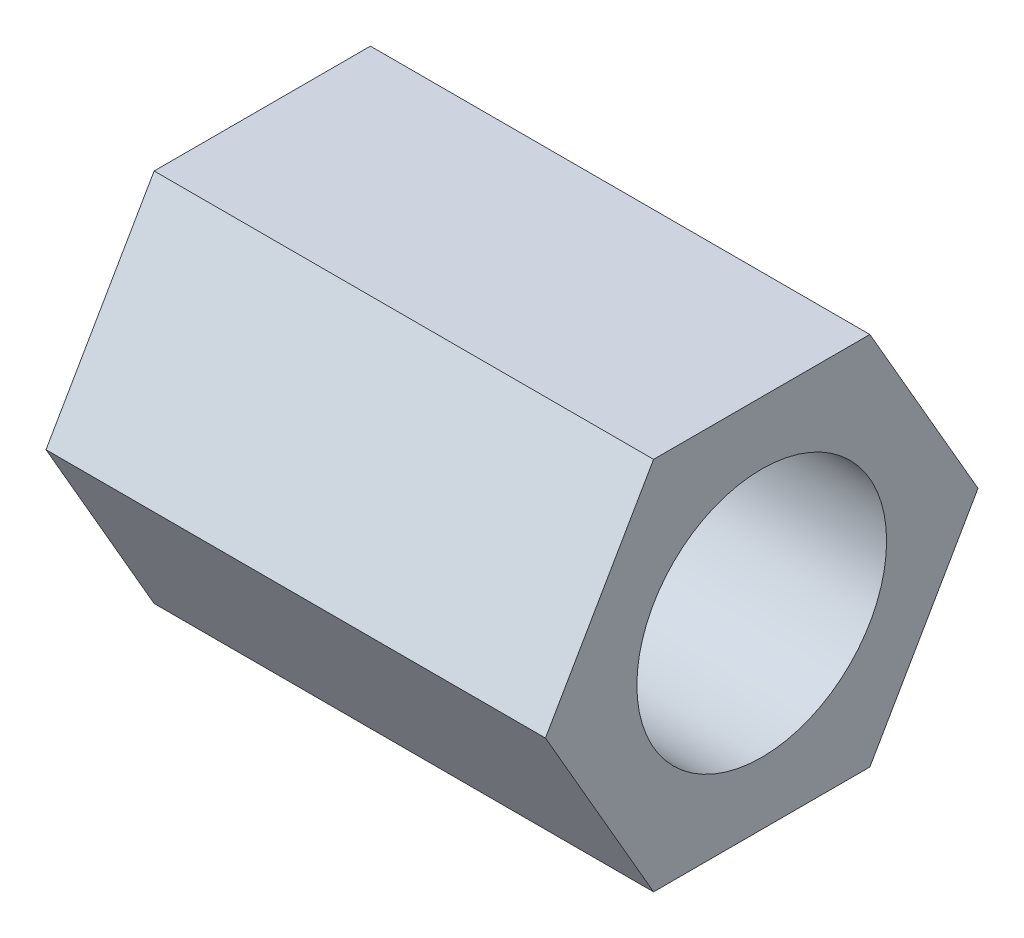
ISO-10303-21;
HEADER;
FILE_DESCRIPTION(('STEP AP214'),'2;1');
FILE_NAME('part.step','',(''),(''),'','','');
FILE_SCHEMA(('AUTOMOTIVE_DESIGN { 1 0 10303 214 1 1 1 1 }'));
ENDSEC;
DATA;
#1=APPLICATION_CONTEXT('core data for automotive mechanical design processes');
#2=APPLICATION_PROTOCOL_DEFINITION('international standard','automotive_design',2000,#1);
#3=PRODUCT_CONTEXT('',#1,'mechanical');
#4=PRODUCT('Part','Part','',(#3));
#5=PRODUCT_RELATED_PRODUCT_CATEGORY('part','',(#4));
#6=PRODUCT_DEFINITION_FORMATION('','',#4);
#7=PRODUCT_DEFINITION_CONTEXT('part definition',#1,'design');
#8=PRODUCT_DEFINITION('design','',#6,#7);
#9=PRODUCT_DEFINITION_SHAPE('','',#8);
#10=(LENGTH_UNIT() NAMED_UNIT(*) SI_UNIT(.MILLI.,.METRE.));
#11=(NAMED_UNIT(*) PLANE_ANGLE_UNIT() SI_UNIT($,.RADIAN.));
#12=(NAMED_UNIT(*) SI_UNIT($,.STERADIAN.) SOLID_ANGLE_UNIT());
#13=UNCERTAINTY_MEASURE_WITH_UNIT(LENGTH_MEASURE(1.E-05),#10,'distance_accuracy_value','');
#14=(GEOMETRIC_REPRESENTATION_CONTEXT(3) GLOBAL_UNCERTAINTY_ASSIGNED_CONTEXT((#13)) GLOBAL_UNIT_ASSIGNED_CONTEXT((#10,
#11,#12)) REPRESENTATION_CONTEXT('',''));
#15=CARTESIAN_POINT('',(0.,0.,0.));
#16=DIRECTION('',(0.,0.,1.));
#17=DIRECTION('',(1.,0.,0.));
#18=AXIS2_PLACEMENT_3D('',#15,#16,#17);
#19=CARTESIAN_POINT('',(12.,0.,-2.59807621135332));
#20=DIRECTION('',(0.,-0.5,0.866025403784438));
#21=DIRECTION('',(0.,-0.866025403784439,-0.5));
#22=AXIS2_PLACEMENT_3D('',#19,#20,#21);
#23=PLANE('',#22);
#24=DIRECTION('',(0.,0.866025403784438,0.5));
#25=VECTOR('',#24,1.);
#26=CARTESIAN_POINT('',(6.,0.,-2.59807621135332));
#27=LINE('',#26,#25);
#28=CARTESIAN_POINT('',(6.,0.,-2.59807621135332));
#29=VERTEX_POINT('',#28);
#30=CARTESIAN_POINT('',(6.,2.25,-1.29903810567666));
#31=VERTEX_POINT('',#30);
#32=EDGE_CURVE('E139',#29,#31,#27,.T.);
#33=ORIENTED_EDGE('',*,*,#32,.T.);
#34=DIRECTION('',(-1.,0.,0.));
#35=VECTOR('',#34,1.);
#36=CARTESIAN_POINT('',(12.,2.25,-1.29903810567666));
#37=LINE('',#36,#35);
#38=CARTESIAN_POINT('',(12.,2.25,-1.29903810567666));
#39=VERTEX_POINT('',#38);
#40=EDGE_CURVE('E55',#39,#31,#37,.T.);
#41=ORIENTED_EDGE('',*,*,#40,.F.);
#42=DIRECTION('',(0.,0.866025403784438,0.5));
#43=VECTOR('',#42,1.);
#44=CARTESIAN_POINT('',(12.,0.,-2.59807621135332));
#45=LINE('',#44,#43);
#46=CARTESIAN_POINT('',(12.,0.,-2.59807621135332));
#47=VERTEX_POINT('',#46);
#48=EDGE_CURVE('E100',#47,#39,#45,.T.);
#49=ORIENTED_EDGE('',*,*,#48,.F.);
#50=DIRECTION('',(-1.,0.,0.));
#51=VECTOR('',#50,1.);
#52=CARTESIAN_POINT('',(12.,0.,-2.59807621135332));
#53=LINE('',#52,#51);
#54=EDGE_CURVE('E11',#47,#29,#53,.T.);
#55=ORIENTED_EDGE('',*,*,#54,.T.);
#56=EDGE_LOOP('',(#33,#41,#49,#55));
#57=FACE_BOUND('',#56,.T.);
#58=ADVANCED_FACE('F45',(#57),#23,.F.);
#59=CARTESIAN_POINT('',(12.,2.25,-1.29903810567666));
#60=DIRECTION('',(0.,-1.,0.));
#61=DIRECTION('',(0.,0.,-1.));
#62=AXIS2_PLACEMENT_3D('',#59,#60,#61);
#63=PLANE('',#62);
#64=DIRECTION('',(0.,0.,1.));
#65=VECTOR('',#64,1.);
#66=CARTESIAN_POINT('',(6.,2.25,-1.29903810567666));
#67=LINE('',#66,#65);
#68=CARTESIAN_POINT('',(6.,2.25,1.29903810567666));
#69=VERTEX_POINT('',#68);
#70=EDGE_CURVE('E143',#31,#69,#67,.T.);
#71=ORIENTED_EDGE('',*,*,#70,.T.);
#72=DIRECTION('',(-1.,0.,0.));
#73=VECTOR('',#72,1.);
#74=CARTESIAN_POINT('',(12.,2.25,1.29903810567666));
#75=LINE('',#74,#73);
#76=CARTESIAN_POINT('',(12.,2.25,1.29903810567666));
#77=VERTEX_POINT('',#76);
#78=EDGE_CURVE('E124',#77,#69,#75,.T.);
#79=ORIENTED_EDGE('',*,*,#78,.F.);
#80=DIRECTION('',(0.,0.,1.));
#81=VECTOR('',#80,1.);
#82=CARTESIAN_POINT('',(12.,2.25,-1.29903810567666));
#83=LINE('',#82,#81);
#84=EDGE_CURVE('E113',#39,#77,#83,.T.);
#85=ORIENTED_EDGE('',*,*,#84,.F.);
#86=ORIENTED_EDGE('',*,*,#40,.T.);
#87=EDGE_LOOP('',(#71,#79,#85,#86));
#88=FACE_BOUND('',#87,.T.);
#89=ADVANCED_FACE('F162',(#88),#63,.F.);
#90=CARTESIAN_POINT('',(12.,2.25,1.29903810567666));
#91=DIRECTION('',(0.,-0.5,-0.866025403784438));
#92=DIRECTION('',(0.,0.866025403784439,-0.5));
#93=AXIS2_PLACEMENT_3D('',#90,#91,#92);
#94=PLANE('',#93);
#95=DIRECTION('',(0.,-0.866025403784439,0.5));
#96=VECTOR('',#95,1.);
#97=CARTESIAN_POINT('',(6.,2.25,1.29903810567666));
#98=LINE('',#97,#96);
#99=CARTESIAN_POINT('',(6.,0.,2.59807621135332));
#100=VERTEX_POINT('',#99);
#101=EDGE_CURVE('E122',#69,#100,#98,.T.);
#102=ORIENTED_EDGE('',*,*,#101,.T.);
#103=DIRECTION('',(-1.,0.,0.));
#104=VECTOR('',#103,1.);
#105=CARTESIAN_POINT('',(12.,0.,2.59807621135332));
#106=LINE('',#105,#104);
#107=CARTESIAN_POINT('',(12.,0.,2.59807621135332));
#108=VERTEX_POINT('',#107);
#109=EDGE_CURVE('E119',#108,#100,#106,.T.);
#110=ORIENTED_EDGE('',*,*,#109,.F.);
#111=DIRECTION('',(0.,-0.866025403784439,0.5));
#112=VECTOR('',#111,1.);
#113=CARTESIAN_POINT('',(12.,2.25,1.29903810567666));
#114=LINE('',#113,#112);
#115=EDGE_CURVE('E107',#77,#108,#114,.T.);
#116=ORIENTED_EDGE('',*,*,#115,.F.);
#117=ORIENTED_EDGE('',*,*,#78,.T.);
#118=EDGE_LOOP('',(#102,#110,#116,#117));
#119=FACE_BOUND('',#118,.T.);
#120=ADVANCED_FACE('F120',(#119),#94,.F.);
#121=CARTESIAN_POINT('',(12.,0.,2.59807621135332));
#122=DIRECTION('',(0.,0.5,-0.866025403784439));
#123=DIRECTION('',(0.,0.866025403784439,0.5));
#124=AXIS2_PLACEMENT_3D('',#121,#122,#123);
#125=PLANE('',#124);
#126=DIRECTION('',(0.,-0.866025403784438,-0.5));
#127=VECTOR('',#126,1.);
#128=CARTESIAN_POINT('',(6.,0.,2.59807621135332));
#129=LINE('',#128,#127);
#130=CARTESIAN_POINT('',(6.,-2.25,1.29903810567666));
#131=VERTEX_POINT('',#130);
#132=EDGE_CURVE('E86',#100,#131,#129,.T.);
#133=ORIENTED_EDGE('',*,*,#132,.T.);
#134=DIRECTION('',(-1.,0.,0.));
#135=VECTOR('',#134,1.);
#136=CARTESIAN_POINT('',(12.,-2.25,1.29903810567666));
#137=LINE('',#136,#135);
#138=CARTESIAN_POINT('',(12.,-2.25,1.29903810567666));
#139=VERTEX_POINT('',#138);
#140=EDGE_CURVE('E125',#139,#131,#137,.T.);
#141=ORIENTED_EDGE('',*,*,#140,.F.);
#142=DIRECTION('',(0.,-0.866025403784438,-0.5));
#143=VECTOR('',#142,1.);
#144=CARTESIAN_POINT('',(12.,0.,2.59807621135332));
#145=LINE('',#144,#143);
#146=EDGE_CURVE('E111',#108,#139,#145,.T.);
#147=ORIENTED_EDGE('',*,*,#146,.F.);
#148=ORIENTED_EDGE('',*,*,#109,.T.);
#149=EDGE_LOOP('',(#133,#141,#147,#148));
#150=FACE_BOUND('',#149,.T.);
#151=ADVANCED_FACE('F127',(#150),#125,.F.);
#152=CARTESIAN_POINT('',(12.,-2.25,1.29903810567666));
#153=DIRECTION('',(0.,1.,0.));
#154=DIRECTION('',(0.,0.,1.));
#155=AXIS2_PLACEMENT_3D('',#152,#153,#154);
#156=PLANE('',#155);
#157=DIRECTION('',(0.,0.,-1.));
#158=VECTOR('',#157,1.);
#159=CARTESIAN_POINT('',(6.,-2.25,1.29903810567666));
#160=LINE('',#159,#158);
#161=CARTESIAN_POINT('',(6.,-2.25,-1.29903810567666));
#162=VERTEX_POINT('',#161);
#163=EDGE_CURVE('E92',#131,#162,#160,.T.);
#164=ORIENTED_EDGE('',*,*,#163,.T.);
#165=DIRECTION('',(-1.,0.,0.));
#166=VECTOR('',#165,1.);
#167=CARTESIAN_POINT('',(12.,-2.25,-1.29903810567666));
#168=LINE('',#167,#166);
#169=CARTESIAN_POINT('',(12.,-2.25,-1.29903810567666));
#170=VERTEX_POINT('',#169);
#171=EDGE_CURVE('E131',#170,#162,#168,.T.);
#172=ORIENTED_EDGE('',*,*,#171,.F.);
#173=DIRECTION('',(0.,0.,-1.));
#174=VECTOR('',#173,1.);
#175=CARTESIAN_POINT('',(12.,-2.25,1.29903810567666));
#176=LINE('',#175,#174);
#177=EDGE_CURVE('E63',#139,#170,#176,.T.);
#178=ORIENTED_EDGE('',*,*,#177,.F.);
#179=ORIENTED_EDGE('',*,*,#140,.T.);
#180=EDGE_LOOP('',(#164,#172,#178,#179));
#181=FACE_BOUND('',#180,.T.);
#182=ADVANCED_FACE('F169',(#181),#156,.F.);
#183=CARTESIAN_POINT('',(12.,0.,0.));
#184=DIRECTION('',(1.,0.,0.));
#185=DIRECTION('',(0.,0.,-1.));
#186=AXIS2_PLACEMENT_3D('',#183,#184,#185);
#187=PLANE('',#186);
#188=CARTESIAN_POINT('',(12.,0.,0.));
#189=DIRECTION('',(1.,0.,0.));
#190=DIRECTION('',(0.,0.,-1.));
#191=AXIS2_PLACEMENT_3D('',#188,#189,#190);
#192=CIRCLE('',#191,1.5);
#193=CARTESIAN_POINT('',(12.,0.,-1.5));
#194=VERTEX_POINT('',#193);
#195=EDGE_CURVE('E232',#194,#194,#192,.T.);
#196=ORIENTED_EDGE('',*,*,#195,.F.);
#197=EDGE_LOOP('',(#196));
#198=FACE_BOUND('',#197,.T.);
#199=DIRECTION('',(0.,0.866025403784439,-0.5));
#200=VECTOR('',#199,1.);
#201=CARTESIAN_POINT('',(12.,-2.25,-1.29903810567666));
#202=LINE('',#201,#200);
#203=EDGE_CURVE('E152',#170,#47,#202,.T.);
#204=ORIENTED_EDGE('',*,*,#203,.T.);
#205=ORIENTED_EDGE('',*,*,#48,.T.);
#206=ORIENTED_EDGE('',*,*,#84,.T.);
#207=ORIENTED_EDGE('',*,*,#115,.T.);
#208=ORIENTED_EDGE('',*,*,#146,.T.);
#209=ORIENTED_EDGE('',*,*,#177,.T.);
#210=EDGE_LOOP('',(#204,#205,#206,#207,#208,#209));
#211=FACE_BOUND('',#210,.T.);
#212=ADVANCED_FACE('F109',(#198,#211),#187,.T.);
#213=CARTESIAN_POINT('',(12.,-2.25,-1.29903810567666));
#214=DIRECTION('',(0.,0.5,0.866025403784439));
#215=DIRECTION('',(0.,-0.866025403784439,0.5));
#216=AXIS2_PLACEMENT_3D('',#213,#214,#215);
#217=PLANE('',#216);
#218=DIRECTION('',(0.,0.866025403784439,-0.5));
#219=VECTOR('',#218,1.);
#220=CARTESIAN_POINT('',(6.,-2.25,-1.29903810567666));
#221=LINE('',#220,#219);
#222=EDGE_CURVE('E135',#162,#29,#221,.T.);
#223=ORIENTED_EDGE('',*,*,#222,.T.);
#224=ORIENTED_EDGE('',*,*,#54,.F.);
#225=ORIENTED_EDGE('',*,*,#203,.F.);
#226=ORIENTED_EDGE('',*,*,#171,.T.);
#227=EDGE_LOOP('',(#223,#224,#225,#226));
#228=FACE_BOUND('',#227,.T.);
#229=ADVANCED_FACE('F47',(#228),#217,.F.);
#230=CARTESIAN_POINT('',(6.,0.,0.));
#231=DIRECTION('',(1.,0.,0.));
#232=DIRECTION('',(0.,0.,-1.));
#233=AXIS2_PLACEMENT_3D('',#230,#231,#232);
#234=PLANE('',#233);
#235=CARTESIAN_POINT('',(6.,0.,0.));
#236=DIRECTION('',(1.,0.,0.));
#237=DIRECTION('',(0.,0.,-1.));
#238=AXIS2_PLACEMENT_3D('',#235,#236,#237);
#239=CIRCLE('',#238,1.5);
#240=CARTESIAN_POINT('',(6.,0.,-1.5));
#241=VERTEX_POINT('',#240);
#242=EDGE_CURVE('E140',#241,#241,#239,.T.);
#243=ORIENTED_EDGE('',*,*,#242,.T.);
#244=EDGE_LOOP('',(#243));
#245=FACE_BOUND('',#244,.T.);
#246=ORIENTED_EDGE('',*,*,#222,.F.);
#247=ORIENTED_EDGE('',*,*,#163,.F.);
#248=ORIENTED_EDGE('',*,*,#132,.F.);
#249=ORIENTED_EDGE('',*,*,#101,.F.);
#250=ORIENTED_EDGE('',*,*,#70,.F.);
#251=ORIENTED_EDGE('',*,*,#32,.F.);
#252=EDGE_LOOP('',(#246,#247,#248,#249,#250,#251));
#253=FACE_BOUND('',#252,.T.);
#254=ADVANCED_FACE('F165',(#245,#253),#234,.F.);
#255=CARTESIAN_POINT('',(5.,0.,0.));
#256=DIRECTION('',(1.,0.,0.));
#257=DIRECTION('',(0.,0.,-1.));
#258=AXIS2_PLACEMENT_3D('',#255,#256,#257);
#259=CYLINDRICAL_SURFACE('',#258,1.5);
#260=ORIENTED_EDGE('',*,*,#195,.T.);
#261=EDGE_LOOP('',(#260));
#262=FACE_BOUND('',#261,.T.);
#263=ORIENTED_EDGE('',*,*,#242,.F.);
#264=EDGE_LOOP('',(#263));
#265=FACE_BOUND('',#264,.T.);
#266=ADVANCED_FACE('F218',(#262,#265),#259,.F.);
#267=CLOSED_SHELL('',(#58,#89,#120,#151,#182,#212,#229,#254,#266));
#268=MANIFOLD_SOLID_BREP('B2',#267);
#269=ADVANCED_BREP_SHAPE_REPRESENTATION('',(#18,#268),#14);
#270=SHAPE_DEFINITION_REPRESENTATION(#9,#269);
ENDSEC;
END-ISO-10303-21;
